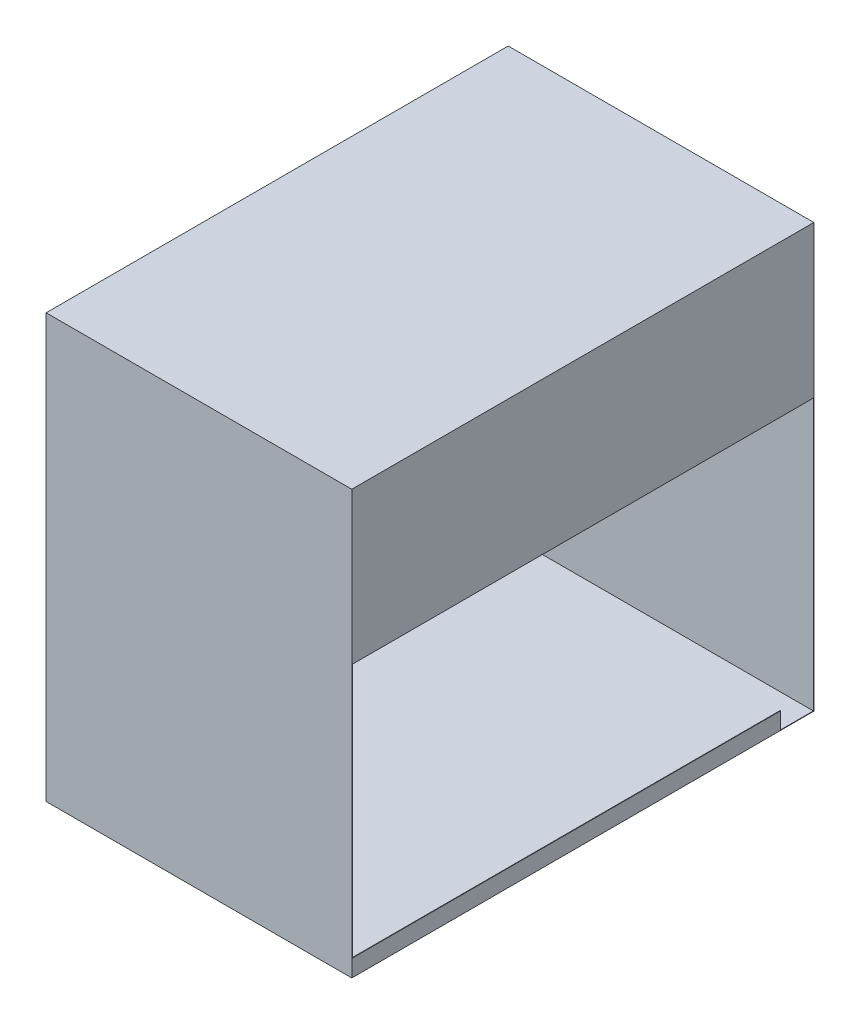
ISO-10303-21;
HEADER;
FILE_DESCRIPTION(('STEP AP214'),'2;1');
FILE_NAME('part.step','',(''),(''),'','','');
FILE_SCHEMA(('AUTOMOTIVE_DESIGN { 1 0 10303 214 1 1 1 1 }'));
ENDSEC;
DATA;
#1=APPLICATION_CONTEXT('core data for automotive mechanical design processes');
#2=APPLICATION_PROTOCOL_DEFINITION('international standard','automotive_design',2000,#1);
#3=PRODUCT_CONTEXT('',#1,'mechanical');
#4=PRODUCT('Part','Part','',(#3));
#5=PRODUCT_RELATED_PRODUCT_CATEGORY('part','',(#4));
#6=PRODUCT_DEFINITION_FORMATION('','',#4);
#7=PRODUCT_DEFINITION_CONTEXT('part definition',#1,'design');
#8=PRODUCT_DEFINITION('design','',#6,#7);
#9=PRODUCT_DEFINITION_SHAPE('','',#8);
#10=(LENGTH_UNIT() NAMED_UNIT(*) SI_UNIT(.MILLI.,.METRE.));
#11=(NAMED_UNIT(*) PLANE_ANGLE_UNIT() SI_UNIT($,.RADIAN.));
#12=(NAMED_UNIT(*) SI_UNIT($,.STERADIAN.) SOLID_ANGLE_UNIT());
#13=UNCERTAINTY_MEASURE_WITH_UNIT(LENGTH_MEASURE(1.E-05),#10,'distance_accuracy_value','');
#14=(GEOMETRIC_REPRESENTATION_CONTEXT(3) GLOBAL_UNCERTAINTY_ASSIGNED_CONTEXT((#13)) GLOBAL_UNIT_ASSIGNED_CONTEXT((#10,
#11,#12)) REPRESENTATION_CONTEXT('',''));
#15=CARTESIAN_POINT('',(0.,0.,0.));
#16=DIRECTION('',(0.,0.,1.));
#17=DIRECTION('',(1.,0.,0.));
#18=AXIS2_PLACEMENT_3D('',#15,#16,#17);
#19=CARTESIAN_POINT('',(0.609599999999904,513.1392,-0.6096));
#20=DIRECTION('',(0.,0.,1.));
#21=DIRECTION('',(1.,0.,0.));
#22=AXIS2_PLACEMENT_3D('',#19,#20,#21);
#23=PLANE('',#22);
#24=DIRECTION('',(0.,1.,0.));
#25=VECTOR('',#24,1.);
#26=CARTESIAN_POINT('',(370.3364,329.4356,-0.6096));
#27=LINE('',#26,#25);
#28=CARTESIAN_POINT('',(370.3364,329.4356,-0.6096));
#29=VERTEX_POINT('',#28);
#30=CARTESIAN_POINT('',(370.3364,513.1392,-0.6096));
#31=VERTEX_POINT('',#30);
#32=EDGE_CURVE('E51',#29,#31,#27,.T.);
#33=ORIENTED_EDGE('',*,*,#32,.F.);
#34=DIRECTION('',(-1.,0.,0.));
#35=VECTOR('',#34,1.);
#36=CARTESIAN_POINT('',(370.946,329.4356,-0.6096));
#37=LINE('',#36,#35);
#38=CARTESIAN_POINT('',(370.946,329.4356,-0.6096));
#39=VERTEX_POINT('',#38);
#40=EDGE_CURVE('E135',#39,#29,#37,.T.);
#41=ORIENTED_EDGE('',*,*,#40,.F.);
#42=DIRECTION('',(0.,-1.,0.));
#43=VECTOR('',#42,1.);
#44=CARTESIAN_POINT('',(370.946,513.1392,-0.6096));
#45=LINE('',#44,#43);
#46=CARTESIAN_POINT('',(370.946,20.6096,-0.6096));
#47=VERTEX_POINT('',#46);
#48=EDGE_CURVE('E37',#39,#47,#45,.T.);
#49=ORIENTED_EDGE('',*,*,#48,.T.);
#50=DIRECTION('',(1.,0.,0.));
#51=VECTOR('',#50,1.);
#52=CARTESIAN_POINT('',(370.946,20.6096,-0.6096));
#53=LINE('',#52,#51);
#54=CARTESIAN_POINT('',(370.3364,20.6096,-0.6096));
#55=VERTEX_POINT('',#54);
#56=EDGE_CURVE('E202',#55,#47,#53,.T.);
#57=ORIENTED_EDGE('',*,*,#56,.F.);
#58=DIRECTION('',(0.,-1.,0.));
#59=VECTOR('',#58,1.);
#60=CARTESIAN_POINT('',(370.3364,20.6096,-0.6096));
#61=LINE('',#60,#59);
#62=CARTESIAN_POINT('',(370.3364,0.6096,-0.6096));
#63=VERTEX_POINT('',#62);
#64=EDGE_CURVE('E59',#55,#63,#61,.T.);
#65=ORIENTED_EDGE('',*,*,#64,.T.);
#66=DIRECTION('',(-1.,0.,0.));
#67=VECTOR('',#66,1.);
#68=CARTESIAN_POINT('',(0.609599999999904,0.6096,-0.6096));
#69=LINE('',#68,#67);
#70=CARTESIAN_POINT('',(0.609599999999904,0.6096,-0.6096));
#71=VERTEX_POINT('',#70);
#72=EDGE_CURVE('E167',#63,#71,#69,.T.);
#73=ORIENTED_EDGE('',*,*,#72,.T.);
#74=DIRECTION('',(0.,-1.,0.));
#75=VECTOR('',#74,1.);
#76=CARTESIAN_POINT('',(0.609599999999904,513.1392,-0.6096));
#77=LINE('',#76,#75);
#78=CARTESIAN_POINT('',(0.609599999999904,513.1392,-0.609599999999988));
#79=VERTEX_POINT('',#78);
#80=EDGE_CURVE('E156',#79,#71,#77,.T.);
#81=ORIENTED_EDGE('',*,*,#80,.F.);
#82=DIRECTION('',(-1.,0.,0.));
#83=VECTOR('',#82,1.);
#84=CARTESIAN_POINT('',(0.609599999999904,513.1392,-0.6096));
#85=LINE('',#84,#83);
#86=EDGE_CURVE('E161',#31,#79,#85,.T.);
#87=ORIENTED_EDGE('',*,*,#86,.F.);
#88=EDGE_LOOP('',(#33,#41,#49,#57,#65,#73,#81,#87));
#89=FACE_BOUND('',#88,.T.);
#90=ADVANCED_FACE('F33',(#89),#23,.F.);
#91=CARTESIAN_POINT('',(0.609599999999995,883.476101722094,-560.1904));
#92=DIRECTION('',(0.,0.,-1.));
#93=DIRECTION('',(-1.,0.,0.));
#94=AXIS2_PLACEMENT_3D('',#91,#92,#93);
#95=PLANE('',#94);
#96=DIRECTION('',(0.,1.,0.));
#97=VECTOR('',#96,1.);
#98=CARTESIAN_POINT('',(370.3364,329.4356,-560.1904));
#99=LINE('',#98,#97);
#100=CARTESIAN_POINT('',(370.3364,329.4356,-560.1904));
#101=VERTEX_POINT('',#100);
#102=CARTESIAN_POINT('',(370.3364,513.1392,-560.1904));
#103=VERTEX_POINT('',#102);
#104=EDGE_CURVE('E230',#101,#103,#99,.T.);
#105=ORIENTED_EDGE('',*,*,#104,.T.);
#106=DIRECTION('',(1.,0.,0.));
#107=VECTOR('',#106,1.);
#108=CARTESIAN_POINT('',(0.609599999999995,513.1392,-560.1904));
#109=LINE('',#108,#107);
#110=CARTESIAN_POINT('',(0.609599999999995,513.1392,-560.1904));
#111=VERTEX_POINT('',#110);
#112=EDGE_CURVE('E181',#111,#103,#109,.T.);
#113=ORIENTED_EDGE('',*,*,#112,.F.);
#114=DIRECTION('',(0.,-1.,0.));
#115=VECTOR('',#114,1.);
#116=CARTESIAN_POINT('',(0.609599999999995,883.476101722094,-560.1904));
#117=LINE('',#116,#115);
#118=CARTESIAN_POINT('',(0.609599999999995,0.6096,-560.1904));
#119=VERTEX_POINT('',#118);
#120=EDGE_CURVE('E193',#111,#119,#117,.T.);
#121=ORIENTED_EDGE('',*,*,#120,.T.);
#122=DIRECTION('',(1.,0.,0.));
#123=VECTOR('',#122,1.);
#124=CARTESIAN_POINT('',(0.609599999999995,0.6096,-560.1904));
#125=LINE('',#124,#123);
#126=CARTESIAN_POINT('',(370.946,0.6096,-560.1904));
#127=VERTEX_POINT('',#126);
#128=EDGE_CURVE('E191',#119,#127,#125,.T.);
#129=ORIENTED_EDGE('',*,*,#128,.T.);
#130=DIRECTION('',(0.,-1.,0.));
#131=VECTOR('',#130,1.);
#132=CARTESIAN_POINT('',(370.946,883.476101722094,-560.1904));
#133=LINE('',#132,#131);
#134=CARTESIAN_POINT('',(370.946,329.4356,-560.1904));
#135=VERTEX_POINT('',#134);
#136=EDGE_CURVE('E186',#135,#127,#133,.T.);
#137=ORIENTED_EDGE('',*,*,#136,.F.);
#138=DIRECTION('',(1.,0.,-1.82123199577621E-13));
#139=VECTOR('',#138,1.);
#140=CARTESIAN_POINT('',(370.946,329.4356,-560.1904));
#141=LINE('',#140,#139);
#142=EDGE_CURVE('E137',#101,#135,#141,.T.);
#143=ORIENTED_EDGE('',*,*,#142,.F.);
#144=EDGE_LOOP('',(#105,#113,#121,#129,#137,#143));
#145=FACE_BOUND('',#144,.T.);
#146=ADVANCED_FACE('F282',(#145),#95,.F.);
#147=CARTESIAN_POINT('',(0.,513.1392,0.));
#148=DIRECTION('',(0.,-1.,0.));
#149=DIRECTION('',(0.,0.,-1.));
#150=AXIS2_PLACEMENT_3D('',#147,#148,#149);
#151=PLANE('',#150);
#152=ORIENTED_EDGE('',*,*,#112,.T.);
#153=DIRECTION('',(0.,0.,-1.));
#154=VECTOR('',#153,1.);
#155=CARTESIAN_POINT('',(370.3364,513.1392,-0.6096));
#156=LINE('',#155,#154);
#157=EDGE_CURVE('E141',#31,#103,#156,.T.);
#158=ORIENTED_EDGE('',*,*,#157,.F.);
#159=ORIENTED_EDGE('',*,*,#86,.T.);
#160=DIRECTION('',(0.,0.,-1.));
#161=VECTOR('',#160,1.);
#162=CARTESIAN_POINT('',(0.609599999999995,513.1392,-560.8));
#163=LINE('',#162,#161);
#164=EDGE_CURVE('E158',#79,#111,#163,.T.);
#165=ORIENTED_EDGE('',*,*,#164,.T.);
#166=EDGE_LOOP('',(#152,#158,#159,#165));
#167=FACE_BOUND('',#166,.T.);
#168=ADVANCED_FACE('F223',(#167),#151,.T.);
#169=CARTESIAN_POINT('',(0.,0.6096,0.));
#170=DIRECTION('',(0.,-1.,0.));
#171=DIRECTION('',(0.,0.,-1.));
#172=AXIS2_PLACEMENT_3D('',#169,#170,#171);
#173=PLANE('',#172);
#174=ORIENTED_EDGE('',*,*,#128,.F.);
#175=DIRECTION('',(0.,0.,-1.));
#176=VECTOR('',#175,1.);
#177=CARTESIAN_POINT('',(0.609599999999995,0.6096,-560.8));
#178=LINE('',#177,#176);
#179=EDGE_CURVE('E155',#71,#119,#178,.T.);
#180=ORIENTED_EDGE('',*,*,#179,.F.);
#181=ORIENTED_EDGE('',*,*,#72,.F.);
#182=DIRECTION('',(0.,0.,1.));
#183=VECTOR('',#182,1.);
#184=CARTESIAN_POINT('',(370.3364,0.6096,-0.6096));
#185=LINE('',#184,#183);
#186=CARTESIAN_POINT('',(370.3364,0.6096,-520.47));
#187=VERTEX_POINT('',#186);
#188=EDGE_CURVE('E198',#187,#63,#185,.T.);
#189=ORIENTED_EDGE('',*,*,#188,.F.);
#190=DIRECTION('',(-1.,0.,0.));
#191=VECTOR('',#190,1.);
#192=CARTESIAN_POINT('',(370.946,0.6096,-520.47));
#193=LINE('',#192,#191);
#194=CARTESIAN_POINT('',(370.946,0.6096,-520.47));
#195=VERTEX_POINT('',#194);
#196=EDGE_CURVE('E185',#195,#187,#193,.T.);
#197=ORIENTED_EDGE('',*,*,#196,.F.);
#198=DIRECTION('',(0.,0.,-1.));
#199=VECTOR('',#198,1.);
#200=CARTESIAN_POINT('',(370.946,0.6096,0.));
#201=LINE('',#200,#199);
#202=EDGE_CURVE('E177',#195,#127,#201,.T.);
#203=ORIENTED_EDGE('',*,*,#202,.T.);
#204=EDGE_LOOP('',(#174,#180,#181,#189,#197,#203));
#205=FACE_BOUND('',#204,.T.);
#206=ADVANCED_FACE('F216',(#205),#173,.F.);
#207=CARTESIAN_POINT('',(0.609599999999995,513.1392,-560.8));
#208=DIRECTION('',(-1.,0.,0.));
#209=DIRECTION('',(0.,0.,1.));
#210=AXIS2_PLACEMENT_3D('',#207,#208,#209);
#211=PLANE('',#210);
#212=ORIENTED_EDGE('',*,*,#120,.F.);
#213=ORIENTED_EDGE('',*,*,#164,.F.);
#214=ORIENTED_EDGE('',*,*,#80,.T.);
#215=ORIENTED_EDGE('',*,*,#179,.T.);
#216=EDGE_LOOP('',(#212,#213,#214,#215));
#217=FACE_BOUND('',#216,.T.);
#218=ADVANCED_FACE('F220',(#217),#211,.F.);
#219=CARTESIAN_POINT('',(0.,0.6096,0.));
#220=DIRECTION('',(1.,0.,0.));
#221=DIRECTION('',(0.,0.,-1.));
#222=AXIS2_PLACEMENT_3D('',#219,#220,#221);
#223=PLANE('',#222);
#224=DIRECTION('',(0.,0.,1.));
#225=VECTOR('',#224,1.);
#226=CARTESIAN_POINT('',(0.,0.,0.));
#227=LINE('',#226,#225);
#228=CARTESIAN_POINT('',(-1.03017288744275E-13,0.,-560.8));
#229=VERTEX_POINT('',#228);
#230=CARTESIAN_POINT('',(0.,0.,0.));
#231=VERTEX_POINT('',#230);
#232=EDGE_CURVE('E174',#229,#231,#227,.T.);
#233=ORIENTED_EDGE('',*,*,#232,.T.);
#234=DIRECTION('',(0.,-1.,0.));
#235=VECTOR('',#234,1.);
#236=CARTESIAN_POINT('',(0.,0.6096,0.));
#237=LINE('',#236,#235);
#238=CARTESIAN_POINT('',(0.,513.7488,0.));
#239=VERTEX_POINT('',#238);
#240=EDGE_CURVE('E11',#239,#231,#237,.T.);
#241=ORIENTED_EDGE('',*,*,#240,.F.);
#242=DIRECTION('',(0.,0.,1.));
#243=VECTOR('',#242,1.);
#244=CARTESIAN_POINT('',(0.,513.7488,0.));
#245=LINE('',#244,#243);
#246=CARTESIAN_POINT('',(0.,513.7488,-560.8));
#247=VERTEX_POINT('',#246);
#248=EDGE_CURVE('E233',#247,#239,#245,.T.);
#249=ORIENTED_EDGE('',*,*,#248,.F.);
#250=DIRECTION('',(0.,-1.,0.));
#251=VECTOR('',#250,1.);
#252=CARTESIAN_POINT('',(-1.03017288744275E-13,0.6096,-560.8));
#253=LINE('',#252,#251);
#254=EDGE_CURVE('E252',#247,#229,#253,.T.);
#255=ORIENTED_EDGE('',*,*,#254,.T.);
#256=EDGE_LOOP('',(#233,#241,#249,#255));
#257=FACE_BOUND('',#256,.T.);
#258=ADVANCED_FACE('F35',(#257),#223,.F.);
#259=CARTESIAN_POINT('',(0.,0.6096,0.));
#260=DIRECTION('',(0.,0.,-1.));
#261=DIRECTION('',(-1.,0.,0.));
#262=AXIS2_PLACEMENT_3D('',#259,#260,#261);
#263=PLANE('',#262);
#264=DIRECTION('',(0.,-1.,0.));
#265=VECTOR('',#264,1.);
#266=CARTESIAN_POINT('',(370.946,0.6096,0.));
#267=LINE('',#266,#265);
#268=CARTESIAN_POINT('',(370.946,513.7488,0.));
#269=VERTEX_POINT('',#268);
#270=CARTESIAN_POINT('',(370.946,0.,0.));
#271=VERTEX_POINT('',#270);
#272=EDGE_CURVE('E43',#269,#271,#267,.T.);
#273=ORIENTED_EDGE('',*,*,#272,.F.);
#274=DIRECTION('',(1.,0.,0.));
#275=VECTOR('',#274,1.);
#276=CARTESIAN_POINT('',(0.,513.7488,0.));
#277=LINE('',#276,#275);
#278=EDGE_CURVE('E236',#239,#269,#277,.T.);
#279=ORIENTED_EDGE('',*,*,#278,.F.);
#280=ORIENTED_EDGE('',*,*,#240,.T.);
#281=DIRECTION('',(1.,0.,0.));
#282=VECTOR('',#281,1.);
#283=CARTESIAN_POINT('',(0.,0.,0.));
#284=LINE('',#283,#282);
#285=EDGE_CURVE('E268',#231,#271,#284,.T.);
#286=ORIENTED_EDGE('',*,*,#285,.T.);
#287=EDGE_LOOP('',(#273,#279,#280,#286));
#288=FACE_BOUND('',#287,.T.);
#289=ADVANCED_FACE('F256',(#288),#263,.F.);
#290=CARTESIAN_POINT('',(370.946,0.6096,0.));
#291=DIRECTION('',(-1.,0.,0.));
#292=DIRECTION('',(0.,0.,1.));
#293=AXIS2_PLACEMENT_3D('',#290,#291,#292);
#294=PLANE('',#293);
#295=ORIENTED_EDGE('',*,*,#48,.F.);
#296=DIRECTION('',(0.,0.,1.));
#297=VECTOR('',#296,1.);
#298=CARTESIAN_POINT('',(370.946,329.4356,-0.6096));
#299=LINE('',#298,#297);
#300=EDGE_CURVE('E132',#135,#39,#299,.T.);
#301=ORIENTED_EDGE('',*,*,#300,.F.);
#302=ORIENTED_EDGE('',*,*,#136,.T.);
#303=ORIENTED_EDGE('',*,*,#202,.F.);
#304=DIRECTION('',(0.,-1.,0.));
#305=VECTOR('',#304,1.);
#306=CARTESIAN_POINT('',(370.946,20.6096,-520.47));
#307=LINE('',#306,#305);
#308=CARTESIAN_POINT('',(370.946,20.6096,-520.47));
#309=VERTEX_POINT('',#308);
#310=EDGE_CURVE('E209',#309,#195,#307,.T.);
#311=ORIENTED_EDGE('',*,*,#310,.F.);
#312=DIRECTION('',(0.,0.,-1.));
#313=VECTOR('',#312,1.);
#314=CARTESIAN_POINT('',(370.946,20.6096,-0.6096));
#315=LINE('',#314,#313);
#316=EDGE_CURVE('E154',#47,#309,#315,.T.);
#317=ORIENTED_EDGE('',*,*,#316,.F.);
#318=EDGE_LOOP('',(#295,#301,#302,#303,#311,#317));
#319=FACE_BOUND('',#318,.T.);
#320=DIRECTION('',(0.,0.,-1.));
#321=VECTOR('',#320,1.);
#322=CARTESIAN_POINT('',(370.946,513.7488,0.));
#323=LINE('',#322,#321);
#324=CARTESIAN_POINT('',(370.946,513.7488,-560.8));
#325=VERTEX_POINT('',#324);
#326=EDGE_CURVE('E239',#269,#325,#323,.T.);
#327=ORIENTED_EDGE('',*,*,#326,.F.);
#328=ORIENTED_EDGE('',*,*,#272,.T.);
#329=DIRECTION('',(0.,0.,-1.));
#330=VECTOR('',#329,1.);
#331=CARTESIAN_POINT('',(370.946,0.,0.));
#332=LINE('',#331,#330);
#333=CARTESIAN_POINT('',(370.946,0.,-560.8));
#334=VERTEX_POINT('',#333);
#335=EDGE_CURVE('E260',#271,#334,#332,.T.);
#336=ORIENTED_EDGE('',*,*,#335,.T.);
#337=DIRECTION('',(0.,-1.,0.));
#338=VECTOR('',#337,1.);
#339=CARTESIAN_POINT('',(370.946,0.6096,-560.8));
#340=LINE('',#339,#338);
#341=EDGE_CURVE('E259',#325,#334,#340,.T.);
#342=ORIENTED_EDGE('',*,*,#341,.F.);
#343=EDGE_LOOP('',(#327,#328,#336,#342));
#344=FACE_BOUND('',#343,.T.);
#345=ADVANCED_FACE('F150',(#319,#344),#294,.F.);
#346=CARTESIAN_POINT('',(-1.03017288744275E-13,0.6096,-560.8));
#347=DIRECTION('',(0.,0.,1.));
#348=DIRECTION('',(1.,0.,0.));
#349=AXIS2_PLACEMENT_3D('',#346,#347,#348);
#350=PLANE('',#349);
#351=DIRECTION('',(-1.,0.,0.));
#352=VECTOR('',#351,1.);
#353=CARTESIAN_POINT('',(-1.03017288744275E-13,0.,-560.8));
#354=LINE('',#353,#352);
#355=EDGE_CURVE('E265',#334,#229,#354,.T.);
#356=ORIENTED_EDGE('',*,*,#355,.T.);
#357=ORIENTED_EDGE('',*,*,#254,.F.);
#358=DIRECTION('',(-1.,0.,0.));
#359=VECTOR('',#358,1.);
#360=CARTESIAN_POINT('',(0.,513.7488,-560.8));
#361=LINE('',#360,#359);
#362=EDGE_CURVE('E195',#325,#247,#361,.T.);
#363=ORIENTED_EDGE('',*,*,#362,.F.);
#364=ORIENTED_EDGE('',*,*,#341,.T.);
#365=EDGE_LOOP('',(#356,#357,#363,#364));
#366=FACE_BOUND('',#365,.T.);
#367=ADVANCED_FACE('F271',(#366),#350,.F.);
#368=CARTESIAN_POINT('',(0.,0.,0.));
#369=DIRECTION('',(0.,-1.,0.));
#370=DIRECTION('',(0.,0.,-1.));
#371=AXIS2_PLACEMENT_3D('',#368,#369,#370);
#372=PLANE('',#371);
#373=ORIENTED_EDGE('',*,*,#232,.F.);
#374=ORIENTED_EDGE('',*,*,#355,.F.);
#375=ORIENTED_EDGE('',*,*,#335,.F.);
#376=ORIENTED_EDGE('',*,*,#285,.F.);
#377=EDGE_LOOP('',(#373,#374,#375,#376));
#378=FACE_BOUND('',#377,.T.);
#379=ADVANCED_FACE('F270',(#378),#372,.T.);
#380=CARTESIAN_POINT('',(370.946,20.6096,-520.47));
#381=DIRECTION('',(0.,0.,1.));
#382=DIRECTION('',(1.,0.,0.));
#383=AXIS2_PLACEMENT_3D('',#380,#381,#382);
#384=PLANE('',#383);
#385=ORIENTED_EDGE('',*,*,#196,.T.);
#386=DIRECTION('',(0.,-1.,0.));
#387=VECTOR('',#386,1.);
#388=CARTESIAN_POINT('',(370.3364,20.6096,-520.47));
#389=LINE('',#388,#387);
#390=CARTESIAN_POINT('',(370.3364,20.6096,-520.47));
#391=VERTEX_POINT('',#390);
#392=EDGE_CURVE('E207',#391,#187,#389,.T.);
#393=ORIENTED_EDGE('',*,*,#392,.F.);
#394=DIRECTION('',(-1.,0.,0.));
#395=VECTOR('',#394,1.);
#396=CARTESIAN_POINT('',(370.946,20.6096,-520.47));
#397=LINE('',#396,#395);
#398=EDGE_CURVE('E197',#309,#391,#397,.T.);
#399=ORIENTED_EDGE('',*,*,#398,.F.);
#400=ORIENTED_EDGE('',*,*,#310,.T.);
#401=EDGE_LOOP('',(#385,#393,#399,#400));
#402=FACE_BOUND('',#401,.T.);
#403=ADVANCED_FACE('F278',(#402),#384,.F.);
#404=CARTESIAN_POINT('',(370.3364,20.6096,-0.6096));
#405=DIRECTION('',(1.,0.,0.));
#406=DIRECTION('',(0.,0.,-1.));
#407=AXIS2_PLACEMENT_3D('',#404,#405,#406);
#408=PLANE('',#407);
#409=ORIENTED_EDGE('',*,*,#188,.T.);
#410=ORIENTED_EDGE('',*,*,#64,.F.);
#411=DIRECTION('',(0.,0.,1.));
#412=VECTOR('',#411,1.);
#413=CARTESIAN_POINT('',(370.3364,20.6096,-0.6096));
#414=LINE('',#413,#412);
#415=EDGE_CURVE('E200',#391,#55,#414,.T.);
#416=ORIENTED_EDGE('',*,*,#415,.F.);
#417=ORIENTED_EDGE('',*,*,#392,.T.);
#418=EDGE_LOOP('',(#409,#410,#416,#417));
#419=FACE_BOUND('',#418,.T.);
#420=ADVANCED_FACE('F305',(#419),#408,.F.);
#421=CARTESIAN_POINT('',(0.,20.6096,0.));
#422=DIRECTION('',(0.,1.,0.));
#423=DIRECTION('',(0.,0.,1.));
#424=AXIS2_PLACEMENT_3D('',#421,#422,#423);
#425=PLANE('',#424);
#426=ORIENTED_EDGE('',*,*,#316,.T.);
#427=ORIENTED_EDGE('',*,*,#398,.T.);
#428=ORIENTED_EDGE('',*,*,#415,.T.);
#429=ORIENTED_EDGE('',*,*,#56,.T.);
#430=EDGE_LOOP('',(#426,#427,#428,#429));
#431=FACE_BOUND('',#430,.T.);
#432=ADVANCED_FACE('F303',(#431),#425,.T.);
#433=CARTESIAN_POINT('',(0.,513.7488,0.));
#434=DIRECTION('',(0.,-1.,0.));
#435=DIRECTION('',(0.,0.,-1.));
#436=AXIS2_PLACEMENT_3D('',#433,#434,#435);
#437=PLANE('',#436);
#438=ORIENTED_EDGE('',*,*,#248,.T.);
#439=ORIENTED_EDGE('',*,*,#278,.T.);
#440=ORIENTED_EDGE('',*,*,#326,.T.);
#441=ORIENTED_EDGE('',*,*,#362,.T.);
#442=EDGE_LOOP('',(#438,#439,#440,#441));
#443=FACE_BOUND('',#442,.T.);
#444=ADVANCED_FACE('F245',(#443),#437,.F.);
#445=CARTESIAN_POINT('',(370.3364,329.4356,-0.6096));
#446=DIRECTION('',(1.,0.,0.));
#447=DIRECTION('',(0.,0.,-1.));
#448=AXIS2_PLACEMENT_3D('',#445,#446,#447);
#449=PLANE('',#448);
#450=ORIENTED_EDGE('',*,*,#157,.T.);
#451=ORIENTED_EDGE('',*,*,#104,.F.);
#452=DIRECTION('',(0.,0.,-1.));
#453=VECTOR('',#452,1.);
#454=CARTESIAN_POINT('',(370.3364,329.4356,-0.6096));
#455=LINE('',#454,#453);
#456=EDGE_CURVE('E147',#29,#101,#455,.T.);
#457=ORIENTED_EDGE('',*,*,#456,.F.);
#458=ORIENTED_EDGE('',*,*,#32,.T.);
#459=EDGE_LOOP('',(#450,#451,#457,#458));
#460=FACE_BOUND('',#459,.T.);
#461=ADVANCED_FACE('F313',(#460),#449,.F.);
#462=CARTESIAN_POINT('',(0.,329.4356,0.));
#463=DIRECTION('',(0.,1.,0.));
#464=DIRECTION('',(0.,0.,1.));
#465=AXIS2_PLACEMENT_3D('',#462,#463,#464);
#466=PLANE('',#465);
#467=ORIENTED_EDGE('',*,*,#300,.T.);
#468=ORIENTED_EDGE('',*,*,#40,.T.);
#469=ORIENTED_EDGE('',*,*,#456,.T.);
#470=ORIENTED_EDGE('',*,*,#142,.T.);
#471=EDGE_LOOP('',(#467,#468,#469,#470));
#472=FACE_BOUND('',#471,.T.);
#473=ADVANCED_FACE('F134',(#472),#466,.F.);
#474=CLOSED_SHELL('',(#90,#146,#168,#206,#218,#258,#289,#345,#367,#379,#403,#420,#432,#444,#461,#473));
#475=MANIFOLD_SOLID_BREP('B2',#474);
#476=ADVANCED_BREP_SHAPE_REPRESENTATION('',(#18,#475),#14);
#477=SHAPE_DEFINITION_REPRESENTATION(#9,#476);
ENDSEC;
END-ISO-10303-21;
